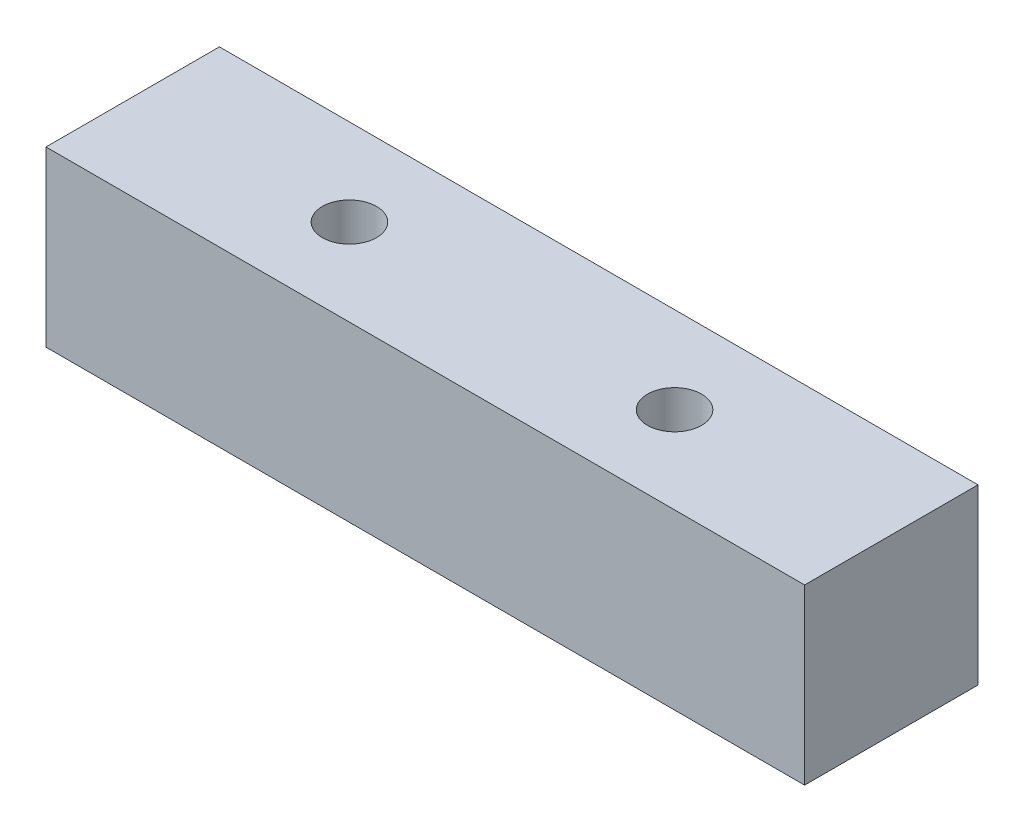
ISO-10303-21;
HEADER;
FILE_DESCRIPTION(('STEP AP214'),'2;1');
FILE_NAME('part.step','',(''),(''),'','','');
FILE_SCHEMA(('AUTOMOTIVE_DESIGN { 1 0 10303 214 1 1 1 1 }'));
ENDSEC;
DATA;
#1=APPLICATION_CONTEXT('core data for automotive mechanical design processes');
#2=APPLICATION_PROTOCOL_DEFINITION('international standard','automotive_design',2000,#1);
#3=PRODUCT_CONTEXT('',#1,'mechanical');
#4=PRODUCT('Part','Part','',(#3));
#5=PRODUCT_RELATED_PRODUCT_CATEGORY('part','',(#4));
#6=PRODUCT_DEFINITION_FORMATION('','',#4);
#7=PRODUCT_DEFINITION_CONTEXT('part definition',#1,'design');
#8=PRODUCT_DEFINITION('design','',#6,#7);
#9=PRODUCT_DEFINITION_SHAPE('','',#8);
#10=(LENGTH_UNIT() NAMED_UNIT(*) SI_UNIT(.MILLI.,.METRE.));
#11=(NAMED_UNIT(*) PLANE_ANGLE_UNIT() SI_UNIT($,.RADIAN.));
#12=(NAMED_UNIT(*) SI_UNIT($,.STERADIAN.) SOLID_ANGLE_UNIT());
#13=UNCERTAINTY_MEASURE_WITH_UNIT(LENGTH_MEASURE(1.E-05),#10,'distance_accuracy_value','');
#14=(GEOMETRIC_REPRESENTATION_CONTEXT(3) GLOBAL_UNCERTAINTY_ASSIGNED_CONTEXT((#13)) GLOBAL_UNIT_ASSIGNED_CONTEXT((#10,
#11,#12)) REPRESENTATION_CONTEXT('',''));
#15=CARTESIAN_POINT('',(0.,0.,0.));
#16=DIRECTION('',(0.,0.,1.));
#17=DIRECTION('',(1.,0.,0.));
#18=AXIS2_PLACEMENT_3D('',#15,#16,#17);
#19=CARTESIAN_POINT('',(0.,20.32,0.));
#20=DIRECTION('',(0.,-1.,0.));
#21=DIRECTION('',(0.,0.,-1.));
#22=AXIS2_PLACEMENT_3D('',#19,#20,#21);
#23=PLANE('',#22);
#24=DIRECTION('',(0.,0.,-1.));
#25=VECTOR('',#24,1.);
#26=CARTESIAN_POINT('',(44.45,20.32,10.16));
#27=LINE('',#26,#25);
#28=CARTESIAN_POINT('',(44.45,20.32,10.16));
#29=VERTEX_POINT('',#28);
#30=CARTESIAN_POINT('',(44.45,20.32,-10.16));
#31=VERTEX_POINT('',#30);
#32=EDGE_CURVE('E84',#29,#31,#27,.T.);
#33=ORIENTED_EDGE('',*,*,#32,.T.);
#34=DIRECTION('',(-1.,0.,0.));
#35=VECTOR('',#34,1.);
#36=CARTESIAN_POINT('',(-44.45,20.32,-10.16));
#37=LINE('',#36,#35);
#38=CARTESIAN_POINT('',(-44.45,20.32,-10.16));
#39=VERTEX_POINT('',#38);
#40=EDGE_CURVE('E79',#31,#39,#37,.T.);
#41=ORIENTED_EDGE('',*,*,#40,.T.);
#42=DIRECTION('',(0.,0.,1.));
#43=VECTOR('',#42,1.);
#44=CARTESIAN_POINT('',(-44.45,20.32,10.16));
#45=LINE('',#44,#43);
#46=CARTESIAN_POINT('',(-44.45,20.32,10.16));
#47=VERTEX_POINT('',#46);
#48=EDGE_CURVE('E82',#39,#47,#45,.T.);
#49=ORIENTED_EDGE('',*,*,#48,.T.);
#50=DIRECTION('',(1.,0.,0.));
#51=VECTOR('',#50,1.);
#52=CARTESIAN_POINT('',(-44.45,20.32,10.16));
#53=LINE('',#52,#51);
#54=EDGE_CURVE('E49',#47,#29,#53,.T.);
#55=ORIENTED_EDGE('',*,*,#54,.T.);
#56=EDGE_LOOP('',(#33,#41,#49,#55));
#57=FACE_BOUND('',#56,.T.);
#58=CARTESIAN_POINT('',(19.05,20.32,0.));
#59=DIRECTION('',(0.,1.,0.));
#60=DIRECTION('',(0.,0.,1.));
#61=AXIS2_PLACEMENT_3D('',#58,#59,#60);
#62=CIRCLE('',#61,3.175);
#63=CARTESIAN_POINT('',(19.05,20.32,3.17500000000001));
#64=VERTEX_POINT('',#63);
#65=EDGE_CURVE('E99',#64,#64,#62,.T.);
#66=ORIENTED_EDGE('',*,*,#65,.F.);
#67=EDGE_LOOP('',(#66));
#68=FACE_BOUND('',#67,.T.);
#69=CARTESIAN_POINT('',(-19.05,20.32,0.));
#70=DIRECTION('',(0.,1.,0.));
#71=DIRECTION('',(0.,0.,1.));
#72=AXIS2_PLACEMENT_3D('',#69,#70,#71);
#73=CIRCLE('',#72,3.175);
#74=CARTESIAN_POINT('',(-19.05,20.32,3.17500000000001));
#75=VERTEX_POINT('',#74);
#76=EDGE_CURVE('E114',#75,#75,#73,.T.);
#77=ORIENTED_EDGE('',*,*,#76,.F.);
#78=EDGE_LOOP('',(#77));
#79=FACE_BOUND('',#78,.T.);
#80=ADVANCED_FACE('F32',(#57,#68,#79),#23,.F.);
#81=CARTESIAN_POINT('',(0.,0.,0.));
#82=DIRECTION('',(0.,-1.,0.));
#83=DIRECTION('',(0.,0.,-1.));
#84=AXIS2_PLACEMENT_3D('',#81,#82,#83);
#85=PLANE('',#84);
#86=CARTESIAN_POINT('',(19.05,0.,0.));
#87=DIRECTION('',(0.,1.,0.));
#88=DIRECTION('',(0.,0.,1.));
#89=AXIS2_PLACEMENT_3D('',#86,#87,#88);
#90=CIRCLE('',#89,3.175);
#91=CARTESIAN_POINT('',(19.05,0.,3.17500000000001));
#92=VERTEX_POINT('',#91);
#93=EDGE_CURVE('E111',#92,#92,#90,.T.);
#94=ORIENTED_EDGE('',*,*,#93,.T.);
#95=EDGE_LOOP('',(#94));
#96=FACE_BOUND('',#95,.T.);
#97=DIRECTION('',(0.,0.,-1.));
#98=VECTOR('',#97,1.);
#99=CARTESIAN_POINT('',(44.45,0.,10.16));
#100=LINE('',#99,#98);
#101=CARTESIAN_POINT('',(44.45,0.,10.16));
#102=VERTEX_POINT('',#101);
#103=CARTESIAN_POINT('',(44.45,0.,-10.16));
#104=VERTEX_POINT('',#103);
#105=EDGE_CURVE('E96',#102,#104,#100,.T.);
#106=ORIENTED_EDGE('',*,*,#105,.F.);
#107=DIRECTION('',(1.,0.,0.));
#108=VECTOR('',#107,1.);
#109=CARTESIAN_POINT('',(-44.45,0.,10.16));
#110=LINE('',#109,#108);
#111=CARTESIAN_POINT('',(-44.45,0.,10.16));
#112=VERTEX_POINT('',#111);
#113=EDGE_CURVE('E72',#112,#102,#110,.T.);
#114=ORIENTED_EDGE('',*,*,#113,.F.);
#115=DIRECTION('',(0.,0.,1.));
#116=VECTOR('',#115,1.);
#117=CARTESIAN_POINT('',(-44.45,0.,10.16));
#118=LINE('',#117,#116);
#119=CARTESIAN_POINT('',(-44.45,0.,-10.16));
#120=VERTEX_POINT('',#119);
#121=EDGE_CURVE('E66',#120,#112,#118,.T.);
#122=ORIENTED_EDGE('',*,*,#121,.F.);
#123=DIRECTION('',(-1.,0.,0.));
#124=VECTOR('',#123,1.);
#125=CARTESIAN_POINT('',(-44.45,0.,-10.16));
#126=LINE('',#125,#124);
#127=EDGE_CURVE('E88',#104,#120,#126,.T.);
#128=ORIENTED_EDGE('',*,*,#127,.F.);
#129=EDGE_LOOP('',(#106,#114,#122,#128));
#130=FACE_BOUND('',#129,.T.);
#131=CARTESIAN_POINT('',(-19.05,0.,0.));
#132=DIRECTION('',(0.,1.,0.));
#133=DIRECTION('',(0.,0.,1.));
#134=AXIS2_PLACEMENT_3D('',#131,#132,#133);
#135=CIRCLE('',#134,3.175);
#136=CARTESIAN_POINT('',(-19.05,0.,3.17500000000001));
#137=VERTEX_POINT('',#136);
#138=EDGE_CURVE('E117',#137,#137,#135,.T.);
#139=ORIENTED_EDGE('',*,*,#138,.T.);
#140=EDGE_LOOP('',(#139));
#141=FACE_BOUND('',#140,.T.);
#142=ADVANCED_FACE('F107',(#96,#130,#141),#85,.T.);
#143=CARTESIAN_POINT('',(44.45,20.32,10.16));
#144=DIRECTION('',(-1.,0.,0.));
#145=DIRECTION('',(0.,0.,1.));
#146=AXIS2_PLACEMENT_3D('',#143,#144,#145);
#147=PLANE('',#146);
#148=ORIENTED_EDGE('',*,*,#105,.T.);
#149=DIRECTION('',(0.,-1.,0.));
#150=VECTOR('',#149,1.);
#151=CARTESIAN_POINT('',(44.45,20.32,-10.16));
#152=LINE('',#151,#150);
#153=EDGE_CURVE('E11',#31,#104,#152,.T.);
#154=ORIENTED_EDGE('',*,*,#153,.F.);
#155=ORIENTED_EDGE('',*,*,#32,.F.);
#156=DIRECTION('',(0.,-1.,0.));
#157=VECTOR('',#156,1.);
#158=CARTESIAN_POINT('',(44.45,20.32,10.16));
#159=LINE('',#158,#157);
#160=EDGE_CURVE('E92',#29,#102,#159,.T.);
#161=ORIENTED_EDGE('',*,*,#160,.T.);
#162=EDGE_LOOP('',(#148,#154,#155,#161));
#163=FACE_BOUND('',#162,.T.);
#164=ADVANCED_FACE('F34',(#163),#147,.F.);
#165=CARTESIAN_POINT('',(-44.45,20.32,-10.16));
#166=DIRECTION('',(0.,0.,1.));
#167=DIRECTION('',(1.,0.,0.));
#168=AXIS2_PLACEMENT_3D('',#165,#166,#167);
#169=PLANE('',#168);
#170=ORIENTED_EDGE('',*,*,#127,.T.);
#171=DIRECTION('',(0.,-1.,0.));
#172=VECTOR('',#171,1.);
#173=CARTESIAN_POINT('',(-44.45,20.32,-10.16));
#174=LINE('',#173,#172);
#175=EDGE_CURVE('E41',#39,#120,#174,.T.);
#176=ORIENTED_EDGE('',*,*,#175,.F.);
#177=ORIENTED_EDGE('',*,*,#40,.F.);
#178=ORIENTED_EDGE('',*,*,#153,.T.);
#179=EDGE_LOOP('',(#170,#176,#177,#178));
#180=FACE_BOUND('',#179,.T.);
#181=ADVANCED_FACE('F87',(#180),#169,.F.);
#182=CARTESIAN_POINT('',(-44.45,20.32,10.16));
#183=DIRECTION('',(1.,0.,0.));
#184=DIRECTION('',(0.,0.,-1.));
#185=AXIS2_PLACEMENT_3D('',#182,#183,#184);
#186=PLANE('',#185);
#187=ORIENTED_EDGE('',*,*,#121,.T.);
#188=DIRECTION('',(0.,-1.,0.));
#189=VECTOR('',#188,1.);
#190=CARTESIAN_POINT('',(-44.45,20.32,10.16));
#191=LINE('',#190,#189);
#192=EDGE_CURVE('E89',#47,#112,#191,.T.);
#193=ORIENTED_EDGE('',*,*,#192,.F.);
#194=ORIENTED_EDGE('',*,*,#48,.F.);
#195=ORIENTED_EDGE('',*,*,#175,.T.);
#196=EDGE_LOOP('',(#187,#193,#194,#195));
#197=FACE_BOUND('',#196,.T.);
#198=ADVANCED_FACE('F90',(#197),#186,.F.);
#199=CARTESIAN_POINT('',(-44.45,20.32,10.16));
#200=DIRECTION('',(0.,0.,-1.));
#201=DIRECTION('',(-1.,0.,0.));
#202=AXIS2_PLACEMENT_3D('',#199,#200,#201);
#203=PLANE('',#202);
#204=ORIENTED_EDGE('',*,*,#113,.T.);
#205=ORIENTED_EDGE('',*,*,#160,.F.);
#206=ORIENTED_EDGE('',*,*,#54,.F.);
#207=ORIENTED_EDGE('',*,*,#192,.T.);
#208=EDGE_LOOP('',(#204,#205,#206,#207));
#209=FACE_BOUND('',#208,.T.);
#210=ADVANCED_FACE('F104',(#209),#203,.F.);
#211=CARTESIAN_POINT('',(19.05,20.32,0.));
#212=DIRECTION('',(0.,-1.,0.));
#213=DIRECTION('',(0.,0.,-1.));
#214=AXIS2_PLACEMENT_3D('',#211,#212,#213);
#215=CYLINDRICAL_SURFACE('',#214,3.175);
#216=ORIENTED_EDGE('',*,*,#65,.T.);
#217=EDGE_LOOP('',(#216));
#218=FACE_BOUND('',#217,.T.);
#219=ORIENTED_EDGE('',*,*,#93,.F.);
#220=EDGE_LOOP('',(#219));
#221=FACE_BOUND('',#220,.T.);
#222=ADVANCED_FACE('F134',(#218,#221),#215,.F.);
#223=CARTESIAN_POINT('',(-19.05,20.32,0.));
#224=DIRECTION('',(0.,-1.,0.));
#225=DIRECTION('',(0.,0.,-1.));
#226=AXIS2_PLACEMENT_3D('',#223,#224,#225);
#227=CYLINDRICAL_SURFACE('',#226,3.175);
#228=ORIENTED_EDGE('',*,*,#76,.T.);
#229=EDGE_LOOP('',(#228));
#230=FACE_BOUND('',#229,.T.);
#231=ORIENTED_EDGE('',*,*,#138,.F.);
#232=EDGE_LOOP('',(#231));
#233=FACE_BOUND('',#232,.T.);
#234=ADVANCED_FACE('F123',(#230,#233),#227,.F.);
#235=CLOSED_SHELL('',(#80,#142,#164,#181,#198,#210,#222,#234));
#236=MANIFOLD_SOLID_BREP('B2',#235);
#237=ADVANCED_BREP_SHAPE_REPRESENTATION('',(#18,#236),#14);
#238=SHAPE_DEFINITION_REPRESENTATION(#9,#237);
ENDSEC;
END-ISO-10303-21;
